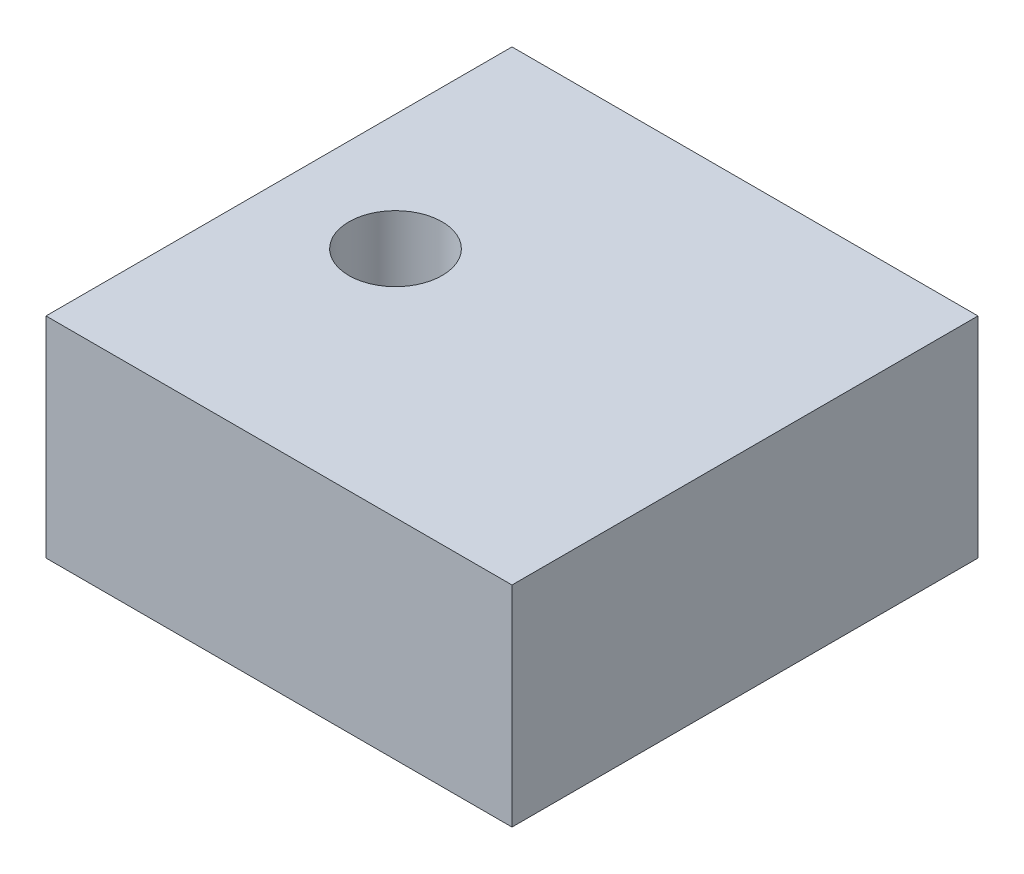
ISO-10303-21;
HEADER;
FILE_DESCRIPTION(('STEP AP214'),'2;1');
FILE_NAME('part.step','',(''),(''),'','','');
FILE_SCHEMA(('AUTOMOTIVE_DESIGN { 1 0 10303 214 1 1 1 1 }'));
ENDSEC;
DATA;
#1=APPLICATION_CONTEXT('core data for automotive mechanical design processes');
#2=APPLICATION_PROTOCOL_DEFINITION('international standard','automotive_design',2000,#1);
#3=PRODUCT_CONTEXT('',#1,'mechanical');
#4=PRODUCT('Part','Part','',(#3));
#5=PRODUCT_RELATED_PRODUCT_CATEGORY('part','',(#4));
#6=PRODUCT_DEFINITION_FORMATION('','',#4);
#7=PRODUCT_DEFINITION_CONTEXT('part definition',#1,'design');
#8=PRODUCT_DEFINITION('design','',#6,#7);
#9=PRODUCT_DEFINITION_SHAPE('','',#8);
#10=(LENGTH_UNIT() NAMED_UNIT(*) SI_UNIT(.MILLI.,.METRE.));
#11=(NAMED_UNIT(*) PLANE_ANGLE_UNIT() SI_UNIT($,.RADIAN.));
#12=(NAMED_UNIT(*) SI_UNIT($,.STERADIAN.) SOLID_ANGLE_UNIT());
#13=UNCERTAINTY_MEASURE_WITH_UNIT(LENGTH_MEASURE(1.E-05),#10,'distance_accuracy_value','');
#14=(GEOMETRIC_REPRESENTATION_CONTEXT(3) GLOBAL_UNCERTAINTY_ASSIGNED_CONTEXT((#13)) GLOBAL_UNIT_ASSIGNED_CONTEXT((#10,
#11,#12)) REPRESENTATION_CONTEXT('',''));
#15=CARTESIAN_POINT('',(0.,0.,0.));
#16=DIRECTION('',(0.,0.,1.));
#17=DIRECTION('',(1.,0.,0.));
#18=AXIS2_PLACEMENT_3D('',#15,#16,#17);
#19=CARTESIAN_POINT('',(0.,18.,0.));
#20=DIRECTION('',(0.,-1.,0.));
#21=DIRECTION('',(0.,0.,-1.));
#22=AXIS2_PLACEMENT_3D('',#19,#20,#21);
#23=PLANE('',#22);
#24=DIRECTION('',(0.,0.,-1.));
#25=VECTOR('',#24,1.);
#26=CARTESIAN_POINT('',(20.,18.,20.));
#27=LINE('',#26,#25);
#28=CARTESIAN_POINT('',(20.,18.,20.));
#29=VERTEX_POINT('',#28);
#30=CARTESIAN_POINT('',(20.,18.,-20.));
#31=VERTEX_POINT('',#30);
#32=EDGE_CURVE('E85',#29,#31,#27,.T.);
#33=ORIENTED_EDGE('',*,*,#32,.T.);
#34=DIRECTION('',(-1.,0.,0.));
#35=VECTOR('',#34,1.);
#36=CARTESIAN_POINT('',(-20.,18.,-20.));
#37=LINE('',#36,#35);
#38=CARTESIAN_POINT('',(-20.,18.,-20.));
#39=VERTEX_POINT('',#38);
#40=EDGE_CURVE('E80',#31,#39,#37,.T.);
#41=ORIENTED_EDGE('',*,*,#40,.T.);
#42=DIRECTION('',(0.,0.,1.));
#43=VECTOR('',#42,1.);
#44=CARTESIAN_POINT('',(-20.,18.,20.));
#45=LINE('',#44,#43);
#46=CARTESIAN_POINT('',(-20.,18.,20.));
#47=VERTEX_POINT('',#46);
#48=EDGE_CURVE('E83',#39,#47,#45,.T.);
#49=ORIENTED_EDGE('',*,*,#48,.T.);
#50=DIRECTION('',(1.,0.,0.));
#51=VECTOR('',#50,1.);
#52=CARTESIAN_POINT('',(-20.,18.,20.));
#53=LINE('',#52,#51);
#54=EDGE_CURVE('E50',#47,#29,#53,.T.);
#55=ORIENTED_EDGE('',*,*,#54,.T.);
#56=EDGE_LOOP('',(#33,#41,#49,#55));
#57=FACE_BOUND('',#56,.T.);
#58=CARTESIAN_POINT('',(-10.,18.,0.));
#59=DIRECTION('',(0.,1.,0.));
#60=DIRECTION('',(0.,0.,1.));
#61=AXIS2_PLACEMENT_3D('',#58,#59,#60);
#62=CIRCLE('',#61,4.00000000000001);
#63=CARTESIAN_POINT('',(-10.,18.,4.00000000000001));
#64=VERTEX_POINT('',#63);
#65=EDGE_CURVE('E100',#64,#64,#62,.T.);
#66=ORIENTED_EDGE('',*,*,#65,.F.);
#67=EDGE_LOOP('',(#66));
#68=FACE_BOUND('',#67,.T.);
#69=ADVANCED_FACE('F33',(#57,#68),#23,.F.);
#70=CARTESIAN_POINT('',(0.,0.,0.));
#71=DIRECTION('',(0.,-1.,0.));
#72=DIRECTION('',(0.,0.,-1.));
#73=AXIS2_PLACEMENT_3D('',#70,#71,#72);
#74=PLANE('',#73);
#75=DIRECTION('',(0.,0.,-1.));
#76=VECTOR('',#75,1.);
#77=CARTESIAN_POINT('',(20.,0.,20.));
#78=LINE('',#77,#76);
#79=CARTESIAN_POINT('',(20.,0.,20.));
#80=VERTEX_POINT('',#79);
#81=CARTESIAN_POINT('',(20.,0.,-20.));
#82=VERTEX_POINT('',#81);
#83=EDGE_CURVE('E97',#80,#82,#78,.T.);
#84=ORIENTED_EDGE('',*,*,#83,.F.);
#85=DIRECTION('',(1.,0.,0.));
#86=VECTOR('',#85,1.);
#87=CARTESIAN_POINT('',(-20.,0.,20.));
#88=LINE('',#87,#86);
#89=CARTESIAN_POINT('',(-20.,0.,20.));
#90=VERTEX_POINT('',#89);
#91=EDGE_CURVE('E73',#90,#80,#88,.T.);
#92=ORIENTED_EDGE('',*,*,#91,.F.);
#93=DIRECTION('',(0.,0.,1.));
#94=VECTOR('',#93,1.);
#95=CARTESIAN_POINT('',(-20.,0.,20.));
#96=LINE('',#95,#94);
#97=CARTESIAN_POINT('',(-20.,0.,-20.));
#98=VERTEX_POINT('',#97);
#99=EDGE_CURVE('E67',#98,#90,#96,.T.);
#100=ORIENTED_EDGE('',*,*,#99,.F.);
#101=DIRECTION('',(-1.,0.,0.));
#102=VECTOR('',#101,1.);
#103=CARTESIAN_POINT('',(-20.,0.,-20.));
#104=LINE('',#103,#102);
#105=EDGE_CURVE('E89',#82,#98,#104,.T.);
#106=ORIENTED_EDGE('',*,*,#105,.F.);
#107=EDGE_LOOP('',(#84,#92,#100,#106));
#108=FACE_BOUND('',#107,.T.);
#109=CARTESIAN_POINT('',(-10.,0.,0.));
#110=DIRECTION('',(0.,1.,0.));
#111=DIRECTION('',(0.,0.,1.));
#112=AXIS2_PLACEMENT_3D('',#109,#110,#111);
#113=CIRCLE('',#112,4.00000000000001);
#114=CARTESIAN_POINT('',(-10.,0.,4.00000000000001));
#115=VERTEX_POINT('',#114);
#116=EDGE_CURVE('E112',#115,#115,#113,.T.);
#117=ORIENTED_EDGE('',*,*,#116,.T.);
#118=EDGE_LOOP('',(#117));
#119=FACE_BOUND('',#118,.T.);
#120=ADVANCED_FACE('F108',(#108,#119),#74,.T.);
#121=CARTESIAN_POINT('',(20.,18.,20.));
#122=DIRECTION('',(-1.,0.,0.));
#123=DIRECTION('',(0.,0.,1.));
#124=AXIS2_PLACEMENT_3D('',#121,#122,#123);
#125=PLANE('',#124);
#126=ORIENTED_EDGE('',*,*,#83,.T.);
#127=DIRECTION('',(0.,-1.,0.));
#128=VECTOR('',#127,1.);
#129=CARTESIAN_POINT('',(20.,18.,-20.));
#130=LINE('',#129,#128);
#131=EDGE_CURVE('E11',#31,#82,#130,.T.);
#132=ORIENTED_EDGE('',*,*,#131,.F.);
#133=ORIENTED_EDGE('',*,*,#32,.F.);
#134=DIRECTION('',(0.,-1.,0.));
#135=VECTOR('',#134,1.);
#136=CARTESIAN_POINT('',(20.,18.,20.));
#137=LINE('',#136,#135);
#138=EDGE_CURVE('E93',#29,#80,#137,.T.);
#139=ORIENTED_EDGE('',*,*,#138,.T.);
#140=EDGE_LOOP('',(#126,#132,#133,#139));
#141=FACE_BOUND('',#140,.T.);
#142=ADVANCED_FACE('F35',(#141),#125,.F.);
#143=CARTESIAN_POINT('',(-20.,18.,-20.));
#144=DIRECTION('',(0.,0.,1.));
#145=DIRECTION('',(1.,0.,0.));
#146=AXIS2_PLACEMENT_3D('',#143,#144,#145);
#147=PLANE('',#146);
#148=ORIENTED_EDGE('',*,*,#105,.T.);
#149=DIRECTION('',(0.,-1.,0.));
#150=VECTOR('',#149,1.);
#151=CARTESIAN_POINT('',(-20.,18.,-20.));
#152=LINE('',#151,#150);
#153=EDGE_CURVE('E42',#39,#98,#152,.T.);
#154=ORIENTED_EDGE('',*,*,#153,.F.);
#155=ORIENTED_EDGE('',*,*,#40,.F.);
#156=ORIENTED_EDGE('',*,*,#131,.T.);
#157=EDGE_LOOP('',(#148,#154,#155,#156));
#158=FACE_BOUND('',#157,.T.);
#159=ADVANCED_FACE('F88',(#158),#147,.F.);
#160=CARTESIAN_POINT('',(-20.,18.,20.));
#161=DIRECTION('',(1.,0.,0.));
#162=DIRECTION('',(0.,0.,-1.));
#163=AXIS2_PLACEMENT_3D('',#160,#161,#162);
#164=PLANE('',#163);
#165=ORIENTED_EDGE('',*,*,#99,.T.);
#166=DIRECTION('',(0.,-1.,0.));
#167=VECTOR('',#166,1.);
#168=CARTESIAN_POINT('',(-20.,18.,20.));
#169=LINE('',#168,#167);
#170=EDGE_CURVE('E90',#47,#90,#169,.T.);
#171=ORIENTED_EDGE('',*,*,#170,.F.);
#172=ORIENTED_EDGE('',*,*,#48,.F.);
#173=ORIENTED_EDGE('',*,*,#153,.T.);
#174=EDGE_LOOP('',(#165,#171,#172,#173));
#175=FACE_BOUND('',#174,.T.);
#176=ADVANCED_FACE('F91',(#175),#164,.F.);
#177=CARTESIAN_POINT('',(-20.,18.,20.));
#178=DIRECTION('',(0.,0.,-1.));
#179=DIRECTION('',(-1.,0.,0.));
#180=AXIS2_PLACEMENT_3D('',#177,#178,#179);
#181=PLANE('',#180);
#182=ORIENTED_EDGE('',*,*,#91,.T.);
#183=ORIENTED_EDGE('',*,*,#138,.F.);
#184=ORIENTED_EDGE('',*,*,#54,.F.);
#185=ORIENTED_EDGE('',*,*,#170,.T.);
#186=EDGE_LOOP('',(#182,#183,#184,#185));
#187=FACE_BOUND('',#186,.T.);
#188=ADVANCED_FACE('F105',(#187),#181,.F.);
#189=CARTESIAN_POINT('',(-10.,18.,0.));
#190=DIRECTION('',(0.,-1.,0.));
#191=DIRECTION('',(0.,0.,-1.));
#192=AXIS2_PLACEMENT_3D('',#189,#190,#191);
#193=CYLINDRICAL_SURFACE('',#192,4.00000000000001);
#194=ORIENTED_EDGE('',*,*,#65,.T.);
#195=EDGE_LOOP('',(#194));
#196=FACE_BOUND('',#195,.T.);
#197=ORIENTED_EDGE('',*,*,#116,.F.);
#198=EDGE_LOOP('',(#197));
#199=FACE_BOUND('',#198,.T.);
#200=ADVANCED_FACE('F118',(#196,#199),#193,.F.);
#201=CLOSED_SHELL('',(#69,#120,#142,#159,#176,#188,#200));
#202=MANIFOLD_SOLID_BREP('B2',#201);
#203=ADVANCED_BREP_SHAPE_REPRESENTATION('',(#18,#202),#14);
#204=SHAPE_DEFINITION_REPRESENTATION(#9,#203);
ENDSEC;
END-ISO-10303-21;
